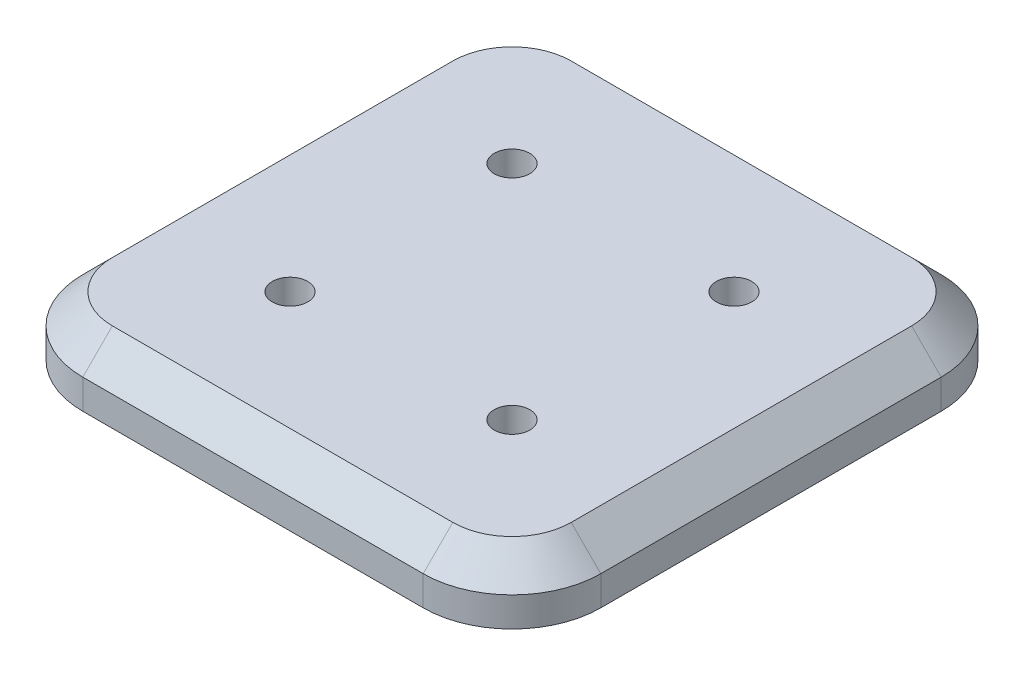
ISO-10303-21;
HEADER;
FILE_DESCRIPTION(('STEP AP214'),'2;1');
FILE_NAME('part.step','',(''),(''),'','','');
FILE_SCHEMA(('AUTOMOTIVE_DESIGN { 1 0 10303 214 1 1 1 1 }'));
ENDSEC;
DATA;
#1=APPLICATION_CONTEXT('core data for automotive mechanical design processes');
#2=APPLICATION_PROTOCOL_DEFINITION('international standard','automotive_design',2000,#1);
#3=PRODUCT_CONTEXT('',#1,'mechanical');
#4=PRODUCT('Part','Part','',(#3));
#5=PRODUCT_RELATED_PRODUCT_CATEGORY('part','',(#4));
#6=PRODUCT_DEFINITION_FORMATION('','',#4);
#7=PRODUCT_DEFINITION_CONTEXT('part definition',#1,'design');
#8=PRODUCT_DEFINITION('design','',#6,#7);
#9=PRODUCT_DEFINITION_SHAPE('','',#8);
#10=(LENGTH_UNIT() NAMED_UNIT(*) SI_UNIT(.MILLI.,.METRE.));
#11=(NAMED_UNIT(*) PLANE_ANGLE_UNIT() SI_UNIT($,.RADIAN.));
#12=(NAMED_UNIT(*) SI_UNIT($,.STERADIAN.) SOLID_ANGLE_UNIT());
#13=UNCERTAINTY_MEASURE_WITH_UNIT(LENGTH_MEASURE(1.E-05),#10,'distance_accuracy_value','');
#14=(GEOMETRIC_REPRESENTATION_CONTEXT(3) GLOBAL_UNCERTAINTY_ASSIGNED_CONTEXT((#13)) GLOBAL_UNIT_ASSIGNED_CONTEXT((#10,
#11,#12)) REPRESENTATION_CONTEXT('',''));
#15=CARTESIAN_POINT('',(0.,0.,0.));
#16=DIRECTION('',(0.,0.,1.));
#17=DIRECTION('',(1.,0.,0.));
#18=AXIS2_PLACEMENT_3D('',#15,#16,#17);
#19=CARTESIAN_POINT('',(-87.5,20.,87.5));
#20=DIRECTION('',(1.,0.,0.));
#21=DIRECTION('',(0.,0.,-1.));
#22=AXIS2_PLACEMENT_3D('',#19,#20,#21);
#23=PLANE('',#22);
#24=DIRECTION('',(0.,-1.,0.));
#25=VECTOR('',#24,1.);
#26=CARTESIAN_POINT('',(-87.5,20.,57.5));
#27=LINE('',#26,#25);
#28=CARTESIAN_POINT('',(-87.5,0.,57.5));
#29=VERTEX_POINT('',#28);
#30=CARTESIAN_POINT('',(-87.5,9.99999999999996,57.5));
#31=VERTEX_POINT('',#30);
#32=EDGE_CURVE('E233',#29,#31,#27,.F.);
#33=ORIENTED_EDGE('',*,*,#32,.T.);
#34=DIRECTION('',(0.,0.,-1.));
#35=VECTOR('',#34,1.);
#36=CARTESIAN_POINT('',(-87.5,9.99999999999996,87.5));
#37=LINE('',#36,#35);
#38=CARTESIAN_POINT('',(-87.5,9.99999999999996,-57.5));
#39=VERTEX_POINT('',#38);
#40=EDGE_CURVE('E42',#31,#39,#37,.T.);
#41=ORIENTED_EDGE('',*,*,#40,.T.);
#42=DIRECTION('',(0.,-1.,0.));
#43=VECTOR('',#42,1.);
#44=CARTESIAN_POINT('',(-87.5,20.,-57.5));
#45=LINE('',#44,#43);
#46=CARTESIAN_POINT('',(-87.5,0.,-57.5));
#47=VERTEX_POINT('',#46);
#48=EDGE_CURVE('E235',#39,#47,#45,.T.);
#49=ORIENTED_EDGE('',*,*,#48,.T.);
#50=DIRECTION('',(0.,0.,1.));
#51=VECTOR('',#50,1.);
#52=CARTESIAN_POINT('',(-87.5,0.,87.5));
#53=LINE('',#52,#51);
#54=EDGE_CURVE('E203',#47,#29,#53,.T.);
#55=ORIENTED_EDGE('',*,*,#54,.T.);
#56=EDGE_LOOP('',(#33,#41,#49,#55));
#57=FACE_BOUND('',#56,.T.);
#58=ADVANCED_FACE('F33',(#57),#23,.F.);
#59=CARTESIAN_POINT('',(87.5,20.,87.5));
#60=DIRECTION('',(0.,0.,-1.));
#61=DIRECTION('',(-1.,0.,0.));
#62=AXIS2_PLACEMENT_3D('',#59,#60,#61);
#63=PLANE('',#62);
#64=DIRECTION('',(0.,-1.,0.));
#65=VECTOR('',#64,1.);
#66=CARTESIAN_POINT('',(57.5,20.,87.5));
#67=LINE('',#66,#65);
#68=CARTESIAN_POINT('',(57.5,0.,87.5));
#69=VERTEX_POINT('',#68);
#70=CARTESIAN_POINT('',(57.5,9.99999999999996,87.5));
#71=VERTEX_POINT('',#70);
#72=EDGE_CURVE('E237',#69,#71,#67,.F.);
#73=ORIENTED_EDGE('',*,*,#72,.T.);
#74=DIRECTION('',(-1.,0.,0.));
#75=VECTOR('',#74,1.);
#76=CARTESIAN_POINT('',(87.5,9.99999999999996,87.5));
#77=LINE('',#76,#75);
#78=CARTESIAN_POINT('',(-57.5,9.99999999999996,87.5));
#79=VERTEX_POINT('',#78);
#80=EDGE_CURVE('E259',#71,#79,#77,.T.);
#81=ORIENTED_EDGE('',*,*,#80,.T.);
#82=DIRECTION('',(0.,-1.,0.));
#83=VECTOR('',#82,1.);
#84=CARTESIAN_POINT('',(-57.5,20.,87.5));
#85=LINE('',#84,#83);
#86=CARTESIAN_POINT('',(-57.5,0.,87.5));
#87=VERTEX_POINT('',#86);
#88=EDGE_CURVE('E240',#79,#87,#85,.T.);
#89=ORIENTED_EDGE('',*,*,#88,.T.);
#90=DIRECTION('',(1.,0.,0.));
#91=VECTOR('',#90,1.);
#92=CARTESIAN_POINT('',(87.5,0.,87.5));
#93=LINE('',#92,#91);
#94=EDGE_CURVE('E206',#87,#69,#93,.T.);
#95=ORIENTED_EDGE('',*,*,#94,.T.);
#96=EDGE_LOOP('',(#73,#81,#89,#95));
#97=FACE_BOUND('',#96,.T.);
#98=ADVANCED_FACE('F325',(#97),#63,.F.);
#99=CARTESIAN_POINT('',(87.5,20.,-87.5));
#100=DIRECTION('',(-1.,0.,0.));
#101=DIRECTION('',(0.,0.,1.));
#102=AXIS2_PLACEMENT_3D('',#99,#100,#101);
#103=PLANE('',#102);
#104=DIRECTION('',(0.,-1.,0.));
#105=VECTOR('',#104,1.);
#106=CARTESIAN_POINT('',(87.5,20.,-57.5));
#107=LINE('',#106,#105);
#108=CARTESIAN_POINT('',(87.5,0.,-57.5));
#109=VERTEX_POINT('',#108);
#110=CARTESIAN_POINT('',(87.5,9.99999999999996,-57.5));
#111=VERTEX_POINT('',#110);
#112=EDGE_CURVE('E230',#109,#111,#107,.F.);
#113=ORIENTED_EDGE('',*,*,#112,.T.);
#114=DIRECTION('',(0.,0.,1.));
#115=VECTOR('',#114,1.);
#116=CARTESIAN_POINT('',(87.5,9.99999999999996,-87.5));
#117=LINE('',#116,#115);
#118=CARTESIAN_POINT('',(87.5,9.99999999999996,57.5));
#119=VERTEX_POINT('',#118);
#120=EDGE_CURVE('E264',#111,#119,#117,.T.);
#121=ORIENTED_EDGE('',*,*,#120,.T.);
#122=DIRECTION('',(0.,-1.,0.));
#123=VECTOR('',#122,1.);
#124=CARTESIAN_POINT('',(87.5,20.,57.5));
#125=LINE('',#124,#123);
#126=CARTESIAN_POINT('',(87.5,0.,57.5));
#127=VERTEX_POINT('',#126);
#128=EDGE_CURVE('E228',#119,#127,#125,.T.);
#129=ORIENTED_EDGE('',*,*,#128,.T.);
#130=DIRECTION('',(0.,0.,-1.));
#131=VECTOR('',#130,1.);
#132=CARTESIAN_POINT('',(87.5,0.,-87.5));
#133=LINE('',#132,#131);
#134=EDGE_CURVE('E209',#127,#109,#133,.T.);
#135=ORIENTED_EDGE('',*,*,#134,.T.);
#136=EDGE_LOOP('',(#113,#121,#129,#135));
#137=FACE_BOUND('',#136,.T.);
#138=ADVANCED_FACE('F356',(#137),#103,.F.);
#139=CARTESIAN_POINT('',(-87.5,20.,-87.5));
#140=DIRECTION('',(0.,0.,1.));
#141=DIRECTION('',(1.,0.,0.));
#142=AXIS2_PLACEMENT_3D('',#139,#140,#141);
#143=PLANE('',#142);
#144=DIRECTION('',(0.,-1.,0.));
#145=VECTOR('',#144,1.);
#146=CARTESIAN_POINT('',(-57.5,20.,-87.5));
#147=LINE('',#146,#145);
#148=CARTESIAN_POINT('',(-57.5,0.,-87.5));
#149=VERTEX_POINT('',#148);
#150=CARTESIAN_POINT('',(-57.5,9.99999999999996,-87.5));
#151=VERTEX_POINT('',#150);
#152=EDGE_CURVE('E215',#149,#151,#147,.F.);
#153=ORIENTED_EDGE('',*,*,#152,.T.);
#154=DIRECTION('',(1.,0.,0.));
#155=VECTOR('',#154,1.);
#156=CARTESIAN_POINT('',(-87.5,9.99999999999996,-87.5));
#157=LINE('',#156,#155);
#158=CARTESIAN_POINT('',(57.5,9.99999999999996,-87.5));
#159=VERTEX_POINT('',#158);
#160=EDGE_CURVE('E268',#151,#159,#157,.T.);
#161=ORIENTED_EDGE('',*,*,#160,.T.);
#162=DIRECTION('',(0.,-1.,0.));
#163=VECTOR('',#162,1.);
#164=CARTESIAN_POINT('',(57.5,20.,-87.5));
#165=LINE('',#164,#163);
#166=CARTESIAN_POINT('',(57.5,0.,-87.5));
#167=VERTEX_POINT('',#166);
#168=EDGE_CURVE('E218',#159,#167,#165,.T.);
#169=ORIENTED_EDGE('',*,*,#168,.T.);
#170=DIRECTION('',(-1.,0.,0.));
#171=VECTOR('',#170,1.);
#172=CARTESIAN_POINT('',(-87.5,0.,-87.5));
#173=LINE('',#172,#171);
#174=EDGE_CURVE('E212',#167,#149,#173,.T.);
#175=ORIENTED_EDGE('',*,*,#174,.T.);
#176=EDGE_LOOP('',(#153,#161,#169,#175));
#177=FACE_BOUND('',#176,.T.);
#178=ADVANCED_FACE('F305',(#177),#143,.F.);
#179=CARTESIAN_POINT('',(0.,20.,0.));
#180=DIRECTION('',(0.,-1.,0.));
#181=DIRECTION('',(0.,0.,-1.));
#182=AXIS2_PLACEMENT_3D('',#179,#180,#181);
#183=PLANE('',#182);
#184=CARTESIAN_POINT('',(-37.5,20.,-37.5));
#185=DIRECTION('',(0.,1.,0.));
#186=DIRECTION('',(0.,0.,1.));
#187=AXIS2_PLACEMENT_3D('',#184,#185,#186);
#188=CIRCLE('',#187,6.);
#189=CARTESIAN_POINT('',(-37.5,20.,-31.5));
#190=VERTEX_POINT('',#189);
#191=EDGE_CURVE('E156',#190,#190,#188,.T.);
#192=ORIENTED_EDGE('',*,*,#191,.F.);
#193=EDGE_LOOP('',(#192));
#194=FACE_BOUND('',#193,.T.);
#195=CARTESIAN_POINT('',(-37.5,20.,37.5));
#196=DIRECTION('',(0.,1.,0.));
#197=DIRECTION('',(0.,0.,1.));
#198=AXIS2_PLACEMENT_3D('',#195,#196,#197);
#199=CIRCLE('',#198,6.);
#200=CARTESIAN_POINT('',(-37.5,20.,43.5));
#201=VERTEX_POINT('',#200);
#202=EDGE_CURVE('E155',#201,#201,#199,.T.);
#203=ORIENTED_EDGE('',*,*,#202,.F.);
#204=EDGE_LOOP('',(#203));
#205=FACE_BOUND('',#204,.T.);
#206=CARTESIAN_POINT('',(37.5,20.,37.5));
#207=DIRECTION('',(0.,1.,0.));
#208=DIRECTION('',(0.,0.,1.));
#209=AXIS2_PLACEMENT_3D('',#206,#207,#208);
#210=CIRCLE('',#209,6.);
#211=CARTESIAN_POINT('',(37.5,20.,43.5));
#212=VERTEX_POINT('',#211);
#213=EDGE_CURVE('E166',#212,#212,#210,.T.);
#214=ORIENTED_EDGE('',*,*,#213,.F.);
#215=EDGE_LOOP('',(#214));
#216=FACE_BOUND('',#215,.T.);
#217=CARTESIAN_POINT('',(37.5,20.,-37.5));
#218=DIRECTION('',(0.,1.,0.));
#219=DIRECTION('',(0.,0.,1.));
#220=AXIS2_PLACEMENT_3D('',#217,#218,#219);
#221=CIRCLE('',#220,6.);
#222=CARTESIAN_POINT('',(37.5,20.,-31.5));
#223=VERTEX_POINT('',#222);
#224=EDGE_CURVE('E172',#223,#223,#221,.T.);
#225=ORIENTED_EDGE('',*,*,#224,.F.);
#226=EDGE_LOOP('',(#225));
#227=FACE_BOUND('',#226,.T.);
#228=CARTESIAN_POINT('',(-57.5,20.,57.5));
#229=DIRECTION('',(0.,-1.,0.));
#230=DIRECTION('',(0.,0.,-1.));
#231=AXIS2_PLACEMENT_3D('',#228,#229,#230);
#232=CIRCLE('',#231,20.);
#233=CARTESIAN_POINT('',(-77.5,20.,57.5));
#234=VERTEX_POINT('',#233);
#235=CARTESIAN_POINT('',(-57.5,20.,77.5));
#236=VERTEX_POINT('',#235);
#237=EDGE_CURVE('E242',#234,#236,#232,.F.);
#238=ORIENTED_EDGE('',*,*,#237,.T.);
#239=DIRECTION('',(1.,0.,0.));
#240=VECTOR('',#239,1.);
#241=CARTESIAN_POINT('',(0.,20.,77.5));
#242=LINE('',#241,#240);
#243=CARTESIAN_POINT('',(57.5,20.,77.5));
#244=VERTEX_POINT('',#243);
#245=EDGE_CURVE('E256',#236,#244,#242,.T.);
#246=ORIENTED_EDGE('',*,*,#245,.T.);
#247=CARTESIAN_POINT('',(57.5,20.,57.5));
#248=DIRECTION('',(0.,-1.,0.));
#249=DIRECTION('',(0.,0.,-1.));
#250=AXIS2_PLACEMENT_3D('',#247,#248,#249);
#251=CIRCLE('',#250,20.);
#252=CARTESIAN_POINT('',(77.5,20.,57.5));
#253=VERTEX_POINT('',#252);
#254=EDGE_CURVE('E254',#244,#253,#251,.F.);
#255=ORIENTED_EDGE('',*,*,#254,.T.);
#256=DIRECTION('',(0.,0.,-1.));
#257=VECTOR('',#256,1.);
#258=CARTESIAN_POINT('',(77.5,20.,0.));
#259=LINE('',#258,#257);
#260=CARTESIAN_POINT('',(77.5,20.,-57.5));
#261=VERTEX_POINT('',#260);
#262=EDGE_CURVE('E252',#253,#261,#259,.T.);
#263=ORIENTED_EDGE('',*,*,#262,.T.);
#264=CARTESIAN_POINT('',(57.5,20.,-57.5));
#265=DIRECTION('',(0.,-1.,0.));
#266=DIRECTION('',(0.,0.,-1.));
#267=AXIS2_PLACEMENT_3D('',#264,#265,#266);
#268=CIRCLE('',#267,20.);
#269=CARTESIAN_POINT('',(57.5,20.,-77.5));
#270=VERTEX_POINT('',#269);
#271=EDGE_CURVE('E250',#261,#270,#268,.F.);
#272=ORIENTED_EDGE('',*,*,#271,.T.);
#273=DIRECTION('',(-1.,0.,0.));
#274=VECTOR('',#273,1.);
#275=CARTESIAN_POINT('',(0.,20.,-77.5));
#276=LINE('',#275,#274);
#277=CARTESIAN_POINT('',(-57.5,20.,-77.5));
#278=VERTEX_POINT('',#277);
#279=EDGE_CURVE('E248',#270,#278,#276,.T.);
#280=ORIENTED_EDGE('',*,*,#279,.T.);
#281=CARTESIAN_POINT('',(-57.5,20.,-57.5));
#282=DIRECTION('',(0.,-1.,0.));
#283=DIRECTION('',(0.,0.,-1.));
#284=AXIS2_PLACEMENT_3D('',#281,#282,#283);
#285=CIRCLE('',#284,20.);
#286=CARTESIAN_POINT('',(-77.5,20.,-57.5));
#287=VERTEX_POINT('',#286);
#288=EDGE_CURVE('E246',#278,#287,#285,.F.);
#289=ORIENTED_EDGE('',*,*,#288,.T.);
#290=DIRECTION('',(0.,0.,1.));
#291=VECTOR('',#290,1.);
#292=CARTESIAN_POINT('',(-77.5,20.,0.));
#293=LINE('',#292,#291);
#294=EDGE_CURVE('E244',#287,#234,#293,.T.);
#295=ORIENTED_EDGE('',*,*,#294,.T.);
#296=EDGE_LOOP('',(#238,#246,#255,#263,#272,#280,#289,#295));
#297=FACE_BOUND('',#296,.T.);
#298=ADVANCED_FACE('F348',(#194,#205,#216,#227,#297),#183,.F.);
#299=CARTESIAN_POINT('',(0.,0.,0.));
#300=DIRECTION('',(0.,-1.,0.));
#301=DIRECTION('',(0.,0.,-1.));
#302=AXIS2_PLACEMENT_3D('',#299,#300,#301);
#303=PLANE('',#302);
#304=CARTESIAN_POINT('',(-62.5,0.,62.5));
#305=DIRECTION('',(0.,-1.,0.));
#306=DIRECTION('',(0.,0.,-1.));
#307=AXIS2_PLACEMENT_3D('',#304,#305,#306);
#308=CIRCLE('',#307,6.);
#309=CARTESIAN_POINT('',(-62.5,0.,56.5));
#310=VERTEX_POINT('',#309);
#311=EDGE_CURVE('E178',#310,#310,#308,.T.);
#312=ORIENTED_EDGE('',*,*,#311,.F.);
#313=EDGE_LOOP('',(#312));
#314=FACE_BOUND('',#313,.T.);
#315=CARTESIAN_POINT('',(62.5,0.,62.5));
#316=DIRECTION('',(0.,-1.,0.));
#317=DIRECTION('',(0.,0.,-1.));
#318=AXIS2_PLACEMENT_3D('',#315,#316,#317);
#319=CIRCLE('',#318,6.00000000000001);
#320=CARTESIAN_POINT('',(62.5,0.,56.5));
#321=VERTEX_POINT('',#320);
#322=EDGE_CURVE('E184',#321,#321,#319,.T.);
#323=ORIENTED_EDGE('',*,*,#322,.F.);
#324=EDGE_LOOP('',(#323));
#325=FACE_BOUND('',#324,.T.);
#326=CARTESIAN_POINT('',(62.5,0.,-62.5));
#327=DIRECTION('',(0.,-1.,0.));
#328=DIRECTION('',(0.,0.,-1.));
#329=AXIS2_PLACEMENT_3D('',#326,#327,#328);
#330=CIRCLE('',#329,6.00000000000001);
#331=CARTESIAN_POINT('',(62.5,0.,-68.5));
#332=VERTEX_POINT('',#331);
#333=EDGE_CURVE('E190',#332,#332,#330,.T.);
#334=ORIENTED_EDGE('',*,*,#333,.F.);
#335=EDGE_LOOP('',(#334));
#336=FACE_BOUND('',#335,.T.);
#337=CARTESIAN_POINT('',(-62.5,0.,-62.5));
#338=DIRECTION('',(0.,-1.,0.));
#339=DIRECTION('',(0.,0.,-1.));
#340=AXIS2_PLACEMENT_3D('',#337,#338,#339);
#341=CIRCLE('',#340,6.);
#342=CARTESIAN_POINT('',(-62.5,0.,-68.5));
#343=VERTEX_POINT('',#342);
#344=EDGE_CURVE('E196',#343,#343,#341,.T.);
#345=ORIENTED_EDGE('',*,*,#344,.F.);
#346=EDGE_LOOP('',(#345));
#347=FACE_BOUND('',#346,.T.);
#348=ORIENTED_EDGE('',*,*,#174,.F.);
#349=CARTESIAN_POINT('',(57.5,0.,-57.5));
#350=DIRECTION('',(0.,-1.,0.));
#351=DIRECTION('',(0.,0.,-1.));
#352=AXIS2_PLACEMENT_3D('',#349,#350,#351);
#353=CIRCLE('',#352,30.);
#354=EDGE_CURVE('E226',#167,#109,#353,.T.);
#355=ORIENTED_EDGE('',*,*,#354,.T.);
#356=ORIENTED_EDGE('',*,*,#134,.F.);
#357=CARTESIAN_POINT('',(57.5,0.,57.5));
#358=DIRECTION('',(0.,-1.,0.));
#359=DIRECTION('',(0.,0.,-1.));
#360=AXIS2_PLACEMENT_3D('',#357,#358,#359);
#361=CIRCLE('',#360,30.);
#362=EDGE_CURVE('E220',#127,#69,#361,.T.);
#363=ORIENTED_EDGE('',*,*,#362,.T.);
#364=ORIENTED_EDGE('',*,*,#94,.F.);
#365=CARTESIAN_POINT('',(-57.5,0.,57.5));
#366=DIRECTION('',(0.,-1.,0.));
#367=DIRECTION('',(0.,0.,-1.));
#368=AXIS2_PLACEMENT_3D('',#365,#366,#367);
#369=CIRCLE('',#368,30.);
#370=EDGE_CURVE('E222',#87,#29,#369,.T.);
#371=ORIENTED_EDGE('',*,*,#370,.T.);
#372=ORIENTED_EDGE('',*,*,#54,.F.);
#373=CARTESIAN_POINT('',(-57.5,0.,-57.5));
#374=DIRECTION('',(0.,-1.,0.));
#375=DIRECTION('',(0.,0.,-1.));
#376=AXIS2_PLACEMENT_3D('',#373,#374,#375);
#377=CIRCLE('',#376,30.);
#378=EDGE_CURVE('E224',#47,#149,#377,.T.);
#379=ORIENTED_EDGE('',*,*,#378,.T.);
#380=EDGE_LOOP('',(#348,#355,#356,#363,#364,#371,#372,#379));
#381=FACE_BOUND('',#380,.T.);
#382=ADVANCED_FACE('F314',(#314,#325,#336,#347,#381),#303,.T.);
#383=CARTESIAN_POINT('',(57.5,20.,-57.5));
#384=DIRECTION('',(0.,-1.,0.));
#385=DIRECTION('',(0.,0.,-1.));
#386=AXIS2_PLACEMENT_3D('',#383,#384,#385);
#387=CYLINDRICAL_SURFACE('',#386,30.);
#388=ORIENTED_EDGE('',*,*,#168,.F.);
#389=CARTESIAN_POINT('',(57.5,9.99999999999996,-57.5));
#390=DIRECTION('',(0.,-1.,0.));
#391=DIRECTION('',(0.,0.,-1.));
#392=AXIS2_PLACEMENT_3D('',#389,#390,#391);
#393=CIRCLE('',#392,30.);
#394=EDGE_CURVE('E266',#159,#111,#393,.T.);
#395=ORIENTED_EDGE('',*,*,#394,.T.);
#396=ORIENTED_EDGE('',*,*,#112,.F.);
#397=ORIENTED_EDGE('',*,*,#354,.F.);
#398=EDGE_LOOP('',(#388,#395,#396,#397));
#399=FACE_BOUND('',#398,.T.);
#400=ADVANCED_FACE('F309',(#399),#387,.T.);
#401=CARTESIAN_POINT('',(-57.5,20.,-57.5));
#402=DIRECTION('',(0.,-1.,0.));
#403=DIRECTION('',(0.,0.,-1.));
#404=AXIS2_PLACEMENT_3D('',#401,#402,#403);
#405=CYLINDRICAL_SURFACE('',#404,30.);
#406=ORIENTED_EDGE('',*,*,#48,.F.);
#407=CARTESIAN_POINT('',(-57.5,9.99999999999996,-57.5));
#408=DIRECTION('',(0.,-1.,0.));
#409=DIRECTION('',(0.,0.,-1.));
#410=AXIS2_PLACEMENT_3D('',#407,#408,#409);
#411=CIRCLE('',#410,30.);
#412=EDGE_CURVE('E270',#39,#151,#411,.T.);
#413=ORIENTED_EDGE('',*,*,#412,.T.);
#414=ORIENTED_EDGE('',*,*,#152,.F.);
#415=ORIENTED_EDGE('',*,*,#378,.F.);
#416=EDGE_LOOP('',(#406,#413,#414,#415));
#417=FACE_BOUND('',#416,.T.);
#418=ADVANCED_FACE('F318',(#417),#405,.T.);
#419=CARTESIAN_POINT('',(-57.5,20.,57.5));
#420=DIRECTION('',(0.,-1.,0.));
#421=DIRECTION('',(0.,0.,-1.));
#422=AXIS2_PLACEMENT_3D('',#419,#420,#421);
#423=CYLINDRICAL_SURFACE('',#422,30.);
#424=ORIENTED_EDGE('',*,*,#88,.F.);
#425=CARTESIAN_POINT('',(-57.5,9.99999999999996,57.5));
#426=DIRECTION('',(0.,-1.,0.));
#427=DIRECTION('',(0.,0.,-1.));
#428=AXIS2_PLACEMENT_3D('',#425,#426,#427);
#429=CIRCLE('',#428,30.);
#430=EDGE_CURVE('E11',#79,#31,#429,.T.);
#431=ORIENTED_EDGE('',*,*,#430,.T.);
#432=ORIENTED_EDGE('',*,*,#32,.F.);
#433=ORIENTED_EDGE('',*,*,#370,.F.);
#434=EDGE_LOOP('',(#424,#431,#432,#433));
#435=FACE_BOUND('',#434,.T.);
#436=ADVANCED_FACE('F320',(#435),#423,.T.);
#437=CARTESIAN_POINT('',(57.5,20.,57.5));
#438=DIRECTION('',(0.,-1.,0.));
#439=DIRECTION('',(0.,0.,-1.));
#440=AXIS2_PLACEMENT_3D('',#437,#438,#439);
#441=CYLINDRICAL_SURFACE('',#440,30.);
#442=ORIENTED_EDGE('',*,*,#128,.F.);
#443=CARTESIAN_POINT('',(57.5,9.99999999999996,57.5));
#444=DIRECTION('',(0.,-1.,0.));
#445=DIRECTION('',(0.,0.,-1.));
#446=AXIS2_PLACEMENT_3D('',#443,#444,#445);
#447=CIRCLE('',#446,30.);
#448=EDGE_CURVE('E262',#119,#71,#447,.T.);
#449=ORIENTED_EDGE('',*,*,#448,.T.);
#450=ORIENTED_EDGE('',*,*,#72,.F.);
#451=ORIENTED_EDGE('',*,*,#362,.F.);
#452=EDGE_LOOP('',(#442,#449,#450,#451));
#453=FACE_BOUND('',#452,.T.);
#454=ADVANCED_FACE('F329',(#453),#441,.T.);
#455=CARTESIAN_POINT('',(0.,20.,-77.5));
#456=DIRECTION('',(0.,-0.707106781186547,0.707106781186548));
#457=DIRECTION('',(-1.,0.,0.));
#458=AXIS2_PLACEMENT_3D('',#455,#456,#457);
#459=PLANE('',#458);
#460=DIRECTION('',(0.,0.707106781186548,0.707106781186547));
#461=VECTOR('',#460,1.);
#462=CARTESIAN_POINT('',(57.5,9.99999999999996,-87.5));
#463=LINE('',#462,#461);
#464=EDGE_CURVE('E287',#159,#270,#463,.T.);
#465=ORIENTED_EDGE('',*,*,#464,.F.);
#466=ORIENTED_EDGE('',*,*,#160,.F.);
#467=DIRECTION('',(0.,-0.707106781186548,-0.707106781186547));
#468=VECTOR('',#467,1.);
#469=CARTESIAN_POINT('',(-57.5,20.,-77.5));
#470=LINE('',#469,#468);
#471=EDGE_CURVE('E37',#278,#151,#470,.T.);
#472=ORIENTED_EDGE('',*,*,#471,.F.);
#473=ORIENTED_EDGE('',*,*,#279,.F.);
#474=EDGE_LOOP('',(#465,#466,#472,#473));
#475=FACE_BOUND('',#474,.T.);
#476=ADVANCED_FACE('F35',(#475),#459,.F.);
#477=CARTESIAN_POINT('',(-57.5,20.,-57.5));
#478=DIRECTION('',(0.,-1.,0.));
#479=DIRECTION('',(0.,0.,-1.));
#480=AXIS2_PLACEMENT_3D('',#477,#478,#479);
#481=CONICAL_SURFACE('',#480,20.,0.785398163397447);
#482=ORIENTED_EDGE('',*,*,#471,.T.);
#483=ORIENTED_EDGE('',*,*,#412,.F.);
#484=DIRECTION('',(-0.707106781186547,-0.707106781186548,0.));
#485=VECTOR('',#484,1.);
#486=CARTESIAN_POINT('',(-77.5,20.,-57.5));
#487=LINE('',#486,#485);
#488=EDGE_CURVE('E285',#287,#39,#487,.T.);
#489=ORIENTED_EDGE('',*,*,#488,.F.);
#490=ORIENTED_EDGE('',*,*,#288,.F.);
#491=EDGE_LOOP('',(#482,#483,#489,#490));
#492=FACE_BOUND('',#491,.T.);
#493=ADVANCED_FACE('F298',(#492),#481,.T.);
#494=CARTESIAN_POINT('',(57.5,20.,-57.5));
#495=DIRECTION('',(0.,-1.,0.));
#496=DIRECTION('',(0.,0.,-1.));
#497=AXIS2_PLACEMENT_3D('',#494,#495,#496);
#498=CONICAL_SURFACE('',#497,20.,0.785398163397447);
#499=ORIENTED_EDGE('',*,*,#464,.T.);
#500=ORIENTED_EDGE('',*,*,#271,.F.);
#501=DIRECTION('',(-0.707106781186547,0.707106781186548,0.));
#502=VECTOR('',#501,1.);
#503=CARTESIAN_POINT('',(87.5,9.99999999999996,-57.5));
#504=LINE('',#503,#502);
#505=EDGE_CURVE('E282',#111,#261,#504,.T.);
#506=ORIENTED_EDGE('',*,*,#505,.F.);
#507=ORIENTED_EDGE('',*,*,#394,.F.);
#508=EDGE_LOOP('',(#499,#500,#506,#507));
#509=FACE_BOUND('',#508,.T.);
#510=ADVANCED_FACE('F351',(#509),#498,.T.);
#511=CARTESIAN_POINT('',(-77.5,20.,0.));
#512=DIRECTION('',(0.707106781186548,-0.707106781186547,0.));
#513=DIRECTION('',(0.,0.,1.));
#514=AXIS2_PLACEMENT_3D('',#511,#512,#513);
#515=PLANE('',#514);
#516=ORIENTED_EDGE('',*,*,#488,.T.);
#517=ORIENTED_EDGE('',*,*,#40,.F.);
#518=DIRECTION('',(-0.707106781186547,-0.707106781186548,0.));
#519=VECTOR('',#518,1.);
#520=CARTESIAN_POINT('',(-77.5,20.,57.5));
#521=LINE('',#520,#519);
#522=EDGE_CURVE('E279',#234,#31,#521,.T.);
#523=ORIENTED_EDGE('',*,*,#522,.F.);
#524=ORIENTED_EDGE('',*,*,#294,.F.);
#525=EDGE_LOOP('',(#516,#517,#523,#524));
#526=FACE_BOUND('',#525,.T.);
#527=ADVANCED_FACE('F346',(#526),#515,.F.);
#528=CARTESIAN_POINT('',(77.5,20.,0.));
#529=DIRECTION('',(-0.707106781186548,-0.707106781186547,0.));
#530=DIRECTION('',(0.,0.,-1.));
#531=AXIS2_PLACEMENT_3D('',#528,#529,#530);
#532=PLANE('',#531);
#533=ORIENTED_EDGE('',*,*,#505,.T.);
#534=ORIENTED_EDGE('',*,*,#262,.F.);
#535=DIRECTION('',(-0.707106781186547,0.707106781186548,0.));
#536=VECTOR('',#535,1.);
#537=CARTESIAN_POINT('',(87.5,9.99999999999996,57.5));
#538=LINE('',#537,#536);
#539=EDGE_CURVE('E276',#119,#253,#538,.T.);
#540=ORIENTED_EDGE('',*,*,#539,.F.);
#541=ORIENTED_EDGE('',*,*,#120,.F.);
#542=EDGE_LOOP('',(#533,#534,#540,#541));
#543=FACE_BOUND('',#542,.T.);
#544=ADVANCED_FACE('F354',(#543),#532,.F.);
#545=CARTESIAN_POINT('',(-57.5,20.,57.5));
#546=DIRECTION('',(0.,-1.,0.));
#547=DIRECTION('',(0.,0.,-1.));
#548=AXIS2_PLACEMENT_3D('',#545,#546,#547);
#549=CONICAL_SURFACE('',#548,20.,0.785398163397447);
#550=ORIENTED_EDGE('',*,*,#522,.T.);
#551=ORIENTED_EDGE('',*,*,#430,.F.);
#552=DIRECTION('',(0.,-0.707106781186548,0.707106781186547));
#553=VECTOR('',#552,1.);
#554=CARTESIAN_POINT('',(-57.5,20.,77.5));
#555=LINE('',#554,#553);
#556=EDGE_CURVE('E274',#236,#79,#555,.T.);
#557=ORIENTED_EDGE('',*,*,#556,.F.);
#558=ORIENTED_EDGE('',*,*,#237,.F.);
#559=EDGE_LOOP('',(#550,#551,#557,#558));
#560=FACE_BOUND('',#559,.T.);
#561=ADVANCED_FACE('F342',(#560),#549,.T.);
#562=CARTESIAN_POINT('',(57.5,20.,57.5));
#563=DIRECTION('',(0.,-1.,0.));
#564=DIRECTION('',(0.,0.,-1.));
#565=AXIS2_PLACEMENT_3D('',#562,#563,#564);
#566=CONICAL_SURFACE('',#565,20.,0.785398163397447);
#567=ORIENTED_EDGE('',*,*,#539,.T.);
#568=ORIENTED_EDGE('',*,*,#254,.F.);
#569=DIRECTION('',(0.,0.707106781186548,-0.707106781186547));
#570=VECTOR('',#569,1.);
#571=CARTESIAN_POINT('',(57.5,9.99999999999996,87.5));
#572=LINE('',#571,#570);
#573=EDGE_CURVE('E202',#71,#244,#572,.T.);
#574=ORIENTED_EDGE('',*,*,#573,.F.);
#575=ORIENTED_EDGE('',*,*,#448,.F.);
#576=EDGE_LOOP('',(#567,#568,#574,#575));
#577=FACE_BOUND('',#576,.T.);
#578=ADVANCED_FACE('F334',(#577),#566,.T.);
#579=CARTESIAN_POINT('',(0.,20.,77.5));
#580=DIRECTION('',(0.,-0.707106781186547,-0.707106781186548));
#581=DIRECTION('',(1.,0.,0.));
#582=AXIS2_PLACEMENT_3D('',#579,#580,#581);
#583=PLANE('',#582);
#584=ORIENTED_EDGE('',*,*,#556,.T.);
#585=ORIENTED_EDGE('',*,*,#80,.F.);
#586=ORIENTED_EDGE('',*,*,#573,.T.);
#587=ORIENTED_EDGE('',*,*,#245,.F.);
#588=EDGE_LOOP('',(#584,#585,#586,#587));
#589=FACE_BOUND('',#588,.T.);
#590=ADVANCED_FACE('F338',(#589),#583,.F.);
#591=CARTESIAN_POINT('',(-62.5,9.99999999999999,-62.5));
#592=DIRECTION('',(0.,-1.,0.));
#593=DIRECTION('',(0.,0.,-1.));
#594=AXIS2_PLACEMENT_3D('',#591,#592,#593);
#595=CONICAL_SURFACE('',#594,6.,1.02974425867665);
#596=CARTESIAN_POINT('',(-62.5,13.6051637141654,-62.5));
#597=VERTEX_POINT('',#596);
#598=VERTEX_LOOP('',#597);
#599=FACE_BOUND('',#598,.T.);
#600=CARTESIAN_POINT('',(-62.5,9.99999999999999,-62.5));
#601=DIRECTION('',(0.,-1.,0.));
#602=DIRECTION('',(0.,0.,-1.));
#603=AXIS2_PLACEMENT_3D('',#600,#601,#602);
#604=CIRCLE('',#603,6.);
#605=CARTESIAN_POINT('',(-62.5,9.99999999999999,-68.5));
#606=VERTEX_POINT('',#605);
#607=EDGE_CURVE('E199',#606,#606,#604,.T.);
#608=ORIENTED_EDGE('',*,*,#607,.T.);
#609=EDGE_LOOP('',(#608));
#610=FACE_BOUND('',#609,.T.);
#611=ADVANCED_FACE('F380',(#599,#610),#595,.F.);
#612=CARTESIAN_POINT('',(-62.5,0.,-62.5));
#613=DIRECTION('',(0.,-1.,0.));
#614=DIRECTION('',(0.,0.,-1.));
#615=AXIS2_PLACEMENT_3D('',#612,#613,#614);
#616=CYLINDRICAL_SURFACE('',#615,6.);
#617=ORIENTED_EDGE('',*,*,#607,.F.);
#618=EDGE_LOOP('',(#617));
#619=FACE_BOUND('',#618,.T.);
#620=ORIENTED_EDGE('',*,*,#344,.T.);
#621=EDGE_LOOP('',(#620));
#622=FACE_BOUND('',#621,.T.);
#623=ADVANCED_FACE('F504',(#619,#622),#616,.F.);
#624=CARTESIAN_POINT('',(62.5,9.99999999999999,-62.5));
#625=DIRECTION('',(0.,-1.,0.));
#626=DIRECTION('',(0.,0.,-1.));
#627=AXIS2_PLACEMENT_3D('',#624,#625,#626);
#628=CONICAL_SURFACE('',#627,6.00000000000001,1.02974425867666);
#629=CARTESIAN_POINT('',(62.5,13.6051637141654,-62.5));
#630=VERTEX_POINT('',#629);
#631=VERTEX_LOOP('',#630);
#632=FACE_BOUND('',#631,.T.);
#633=CARTESIAN_POINT('',(62.5,9.99999999999999,-62.5));
#634=DIRECTION('',(0.,-1.,0.));
#635=DIRECTION('',(0.,0.,-1.));
#636=AXIS2_PLACEMENT_3D('',#633,#634,#635);
#637=CIRCLE('',#636,6.00000000000001);
#638=CARTESIAN_POINT('',(62.5,9.99999999999999,-68.5));
#639=VERTEX_POINT('',#638);
#640=EDGE_CURVE('E193',#639,#639,#637,.T.);
#641=ORIENTED_EDGE('',*,*,#640,.T.);
#642=EDGE_LOOP('',(#641));
#643=FACE_BOUND('',#642,.T.);
#644=ADVANCED_FACE('F513',(#632,#643),#628,.F.);
#645=CARTESIAN_POINT('',(62.5,0.,-62.5));
#646=DIRECTION('',(0.,-1.,0.));
#647=DIRECTION('',(0.,0.,-1.));
#648=AXIS2_PLACEMENT_3D('',#645,#646,#647);
#649=CYLINDRICAL_SURFACE('',#648,6.00000000000001);
#650=ORIENTED_EDGE('',*,*,#640,.F.);
#651=EDGE_LOOP('',(#650));
#652=FACE_BOUND('',#651,.T.);
#653=ORIENTED_EDGE('',*,*,#333,.T.);
#654=EDGE_LOOP('',(#653));
#655=FACE_BOUND('',#654,.T.);
#656=ADVANCED_FACE('F522',(#652,#655),#649,.F.);
#657=CARTESIAN_POINT('',(62.5,9.99999999999999,62.5));
#658=DIRECTION('',(0.,-1.,0.));
#659=DIRECTION('',(0.,0.,-1.));
#660=AXIS2_PLACEMENT_3D('',#657,#658,#659);
#661=CONICAL_SURFACE('',#660,6.00000000000001,1.02974425867666);
#662=CARTESIAN_POINT('',(62.5,13.6051637141654,62.5));
#663=VERTEX_POINT('',#662);
#664=VERTEX_LOOP('',#663);
#665=FACE_BOUND('',#664,.T.);
#666=CARTESIAN_POINT('',(62.5,9.99999999999999,62.5));
#667=DIRECTION('',(0.,-1.,0.));
#668=DIRECTION('',(0.,0.,-1.));
#669=AXIS2_PLACEMENT_3D('',#666,#667,#668);
#670=CIRCLE('',#669,6.00000000000001);
#671=CARTESIAN_POINT('',(62.5,9.99999999999999,56.5));
#672=VERTEX_POINT('',#671);
#673=EDGE_CURVE('E187',#672,#672,#670,.T.);
#674=ORIENTED_EDGE('',*,*,#673,.T.);
#675=EDGE_LOOP('',(#674));
#676=FACE_BOUND('',#675,.T.);
#677=ADVANCED_FACE('F531',(#665,#676),#661,.F.);
#678=CARTESIAN_POINT('',(62.5,0.,62.5));
#679=DIRECTION('',(0.,-1.,0.));
#680=DIRECTION('',(0.,0.,-1.));
#681=AXIS2_PLACEMENT_3D('',#678,#679,#680);
#682=CYLINDRICAL_SURFACE('',#681,6.00000000000001);
#683=ORIENTED_EDGE('',*,*,#673,.F.);
#684=EDGE_LOOP('',(#683));
#685=FACE_BOUND('',#684,.T.);
#686=ORIENTED_EDGE('',*,*,#322,.T.);
#687=EDGE_LOOP('',(#686));
#688=FACE_BOUND('',#687,.T.);
#689=ADVANCED_FACE('F540',(#685,#688),#682,.F.);
#690=CARTESIAN_POINT('',(-62.5,9.99999999999999,62.5));
#691=DIRECTION('',(0.,-1.,0.));
#692=DIRECTION('',(0.,0.,-1.));
#693=AXIS2_PLACEMENT_3D('',#690,#691,#692);
#694=CONICAL_SURFACE('',#693,6.,1.02974425867665);
#695=CARTESIAN_POINT('',(-62.5,13.6051637141654,62.5));
#696=VERTEX_POINT('',#695);
#697=VERTEX_LOOP('',#696);
#698=FACE_BOUND('',#697,.T.);
#699=CARTESIAN_POINT('',(-62.5,9.99999999999999,62.5));
#700=DIRECTION('',(0.,-1.,0.));
#701=DIRECTION('',(0.,0.,-1.));
#702=AXIS2_PLACEMENT_3D('',#699,#700,#701);
#703=CIRCLE('',#702,6.);
#704=CARTESIAN_POINT('',(-62.5,9.99999999999999,56.5));
#705=VERTEX_POINT('',#704);
#706=EDGE_CURVE('E181',#705,#705,#703,.T.);
#707=ORIENTED_EDGE('',*,*,#706,.T.);
#708=EDGE_LOOP('',(#707));
#709=FACE_BOUND('',#708,.T.);
#710=ADVANCED_FACE('F549',(#698,#709),#694,.F.);
#711=CARTESIAN_POINT('',(-62.5,0.,62.5));
#712=DIRECTION('',(0.,-1.,0.));
#713=DIRECTION('',(0.,0.,-1.));
#714=AXIS2_PLACEMENT_3D('',#711,#712,#713);
#715=CYLINDRICAL_SURFACE('',#714,6.);
#716=ORIENTED_EDGE('',*,*,#706,.F.);
#717=EDGE_LOOP('',(#716));
#718=FACE_BOUND('',#717,.T.);
#719=ORIENTED_EDGE('',*,*,#311,.T.);
#720=EDGE_LOOP('',(#719));
#721=FACE_BOUND('',#720,.T.);
#722=ADVANCED_FACE('F558',(#718,#721),#715,.F.);
#723=CARTESIAN_POINT('',(37.5,10.,-37.5));
#724=DIRECTION('',(0.,1.,0.));
#725=DIRECTION('',(0.,0.,1.));
#726=AXIS2_PLACEMENT_3D('',#723,#724,#725);
#727=CONICAL_SURFACE('',#726,6.,1.02974425867665);
#728=CARTESIAN_POINT('',(37.5,6.39483628583465,-37.5));
#729=VERTEX_POINT('',#728);
#730=VERTEX_LOOP('',#729);
#731=FACE_BOUND('',#730,.T.);
#732=CARTESIAN_POINT('',(37.5,10.,-37.5));
#733=DIRECTION('',(0.,1.,0.));
#734=DIRECTION('',(0.,0.,1.));
#735=AXIS2_PLACEMENT_3D('',#732,#733,#734);
#736=CIRCLE('',#735,6.);
#737=CARTESIAN_POINT('',(37.5,10.,-31.5));
#738=VERTEX_POINT('',#737);
#739=EDGE_CURVE('E175',#738,#738,#736,.T.);
#740=ORIENTED_EDGE('',*,*,#739,.T.);
#741=EDGE_LOOP('',(#740));
#742=FACE_BOUND('',#741,.T.);
#743=ADVANCED_FACE('F566',(#731,#742),#727,.F.);
#744=CARTESIAN_POINT('',(37.5,20.,-37.5));
#745=DIRECTION('',(0.,1.,0.));
#746=DIRECTION('',(0.,0.,1.));
#747=AXIS2_PLACEMENT_3D('',#744,#745,#746);
#748=CYLINDRICAL_SURFACE('',#747,6.);
#749=ORIENTED_EDGE('',*,*,#739,.F.);
#750=EDGE_LOOP('',(#749));
#751=FACE_BOUND('',#750,.T.);
#752=ORIENTED_EDGE('',*,*,#224,.T.);
#753=EDGE_LOOP('',(#752));
#754=FACE_BOUND('',#753,.T.);
#755=ADVANCED_FACE('F574',(#751,#754),#748,.F.);
#756=CARTESIAN_POINT('',(37.5,10.,37.5));
#757=DIRECTION('',(0.,1.,0.));
#758=DIRECTION('',(0.,0.,1.));
#759=AXIS2_PLACEMENT_3D('',#756,#757,#758);
#760=CONICAL_SURFACE('',#759,6.,1.02974425867665);
#761=CARTESIAN_POINT('',(37.5,6.39483628583465,37.5));
#762=VERTEX_POINT('',#761);
#763=VERTEX_LOOP('',#762);
#764=FACE_BOUND('',#763,.T.);
#765=CARTESIAN_POINT('',(37.5,10.,37.5));
#766=DIRECTION('',(0.,1.,0.));
#767=DIRECTION('',(0.,0.,1.));
#768=AXIS2_PLACEMENT_3D('',#765,#766,#767);
#769=CIRCLE('',#768,6.);
#770=CARTESIAN_POINT('',(37.5,10.,43.5));
#771=VERTEX_POINT('',#770);
#772=EDGE_CURVE('E169',#771,#771,#769,.T.);
#773=ORIENTED_EDGE('',*,*,#772,.T.);
#774=EDGE_LOOP('',(#773));
#775=FACE_BOUND('',#774,.T.);
#776=ADVANCED_FACE('F583',(#764,#775),#760,.F.);
#777=CARTESIAN_POINT('',(37.5,20.,37.5));
#778=DIRECTION('',(0.,1.,0.));
#779=DIRECTION('',(0.,0.,1.));
#780=AXIS2_PLACEMENT_3D('',#777,#778,#779);
#781=CYLINDRICAL_SURFACE('',#780,6.);
#782=ORIENTED_EDGE('',*,*,#772,.F.);
#783=EDGE_LOOP('',(#782));
#784=FACE_BOUND('',#783,.T.);
#785=ORIENTED_EDGE('',*,*,#213,.T.);
#786=EDGE_LOOP('',(#785));
#787=FACE_BOUND('',#786,.T.);
#788=ADVANCED_FACE('F592',(#784,#787),#781,.F.);
#789=CARTESIAN_POINT('',(-37.5,10.,37.5));
#790=DIRECTION('',(0.,1.,0.));
#791=DIRECTION('',(0.,0.,1.));
#792=AXIS2_PLACEMENT_3D('',#789,#790,#791);
#793=CONICAL_SURFACE('',#792,6.,1.02974425867665);
#794=CARTESIAN_POINT('',(-37.5,6.39483628583465,37.5));
#795=VERTEX_POINT('',#794);
#796=VERTEX_LOOP('',#795);
#797=FACE_BOUND('',#796,.T.);
#798=CARTESIAN_POINT('',(-37.5,10.,37.5));
#799=DIRECTION('',(0.,1.,0.));
#800=DIRECTION('',(0.,0.,1.));
#801=AXIS2_PLACEMENT_3D('',#798,#799,#800);
#802=CIRCLE('',#801,6.);
#803=CARTESIAN_POINT('',(-37.5,10.,43.5));
#804=VERTEX_POINT('',#803);
#805=EDGE_CURVE('E159',#804,#804,#802,.T.);
#806=ORIENTED_EDGE('',*,*,#805,.T.);
#807=EDGE_LOOP('',(#806));
#808=FACE_BOUND('',#807,.T.);
#809=ADVANCED_FACE('F601',(#797,#808),#793,.F.);
#810=CARTESIAN_POINT('',(-37.5,20.,37.5));
#811=DIRECTION('',(0.,1.,0.));
#812=DIRECTION('',(0.,0.,1.));
#813=AXIS2_PLACEMENT_3D('',#810,#811,#812);
#814=CYLINDRICAL_SURFACE('',#813,6.);
#815=ORIENTED_EDGE('',*,*,#805,.F.);
#816=EDGE_LOOP('',(#815));
#817=FACE_BOUND('',#816,.T.);
#818=ORIENTED_EDGE('',*,*,#202,.T.);
#819=EDGE_LOOP('',(#818));
#820=FACE_BOUND('',#819,.T.);
#821=ADVANCED_FACE('F149',(#817,#820),#814,.F.);
#822=CARTESIAN_POINT('',(-37.5,10.,-37.5));
#823=DIRECTION('',(0.,1.,0.));
#824=DIRECTION('',(0.,0.,1.));
#825=AXIS2_PLACEMENT_3D('',#822,#823,#824);
#826=CONICAL_SURFACE('',#825,6.,1.02974425867665);
#827=CARTESIAN_POINT('',(-37.5,6.39483628583465,-37.5));
#828=VERTEX_POINT('',#827);
#829=VERTEX_LOOP('',#828);
#830=FACE_BOUND('',#829,.T.);
#831=CARTESIAN_POINT('',(-37.5,10.,-37.5));
#832=DIRECTION('',(0.,1.,0.));
#833=DIRECTION('',(0.,0.,1.));
#834=AXIS2_PLACEMENT_3D('',#831,#832,#833);
#835=CIRCLE('',#834,6.);
#836=CARTESIAN_POINT('',(-37.5,10.,-31.5));
#837=VERTEX_POINT('',#836);
#838=EDGE_CURVE('E153',#837,#837,#835,.T.);
#839=ORIENTED_EDGE('',*,*,#838,.T.);
#840=EDGE_LOOP('',(#839));
#841=FACE_BOUND('',#840,.T.);
#842=ADVANCED_FACE('F145',(#830,#841),#826,.F.);
#843=CARTESIAN_POINT('',(-37.5,20.,-37.5));
#844=DIRECTION('',(0.,1.,0.));
#845=DIRECTION('',(0.,0.,1.));
#846=AXIS2_PLACEMENT_3D('',#843,#844,#845);
#847=CYLINDRICAL_SURFACE('',#846,6.);
#848=ORIENTED_EDGE('',*,*,#838,.F.);
#849=EDGE_LOOP('',(#848));
#850=FACE_BOUND('',#849,.T.);
#851=ORIENTED_EDGE('',*,*,#191,.T.);
#852=EDGE_LOOP('',(#851));
#853=FACE_BOUND('',#852,.T.);
#854=ADVANCED_FACE('F148',(#850,#853),#847,.F.);
#855=CLOSED_SHELL('',(#58,#98,#138,#178,#298,#382,#400,#418,#436,#454,#476,#493,#510,#527,#544,
#561,#578,#590,#611,#623,#644,#656,#677,#689,#710,#722,#743,#755,#776,#788,#809,#821,#842,#854));
#856=MANIFOLD_SOLID_BREP('B2',#855);
#857=ADVANCED_BREP_SHAPE_REPRESENTATION('',(#18,#856),#14);
#858=SHAPE_DEFINITION_REPRESENTATION(#9,#857);
ENDSEC;
END-ISO-10303-21;
